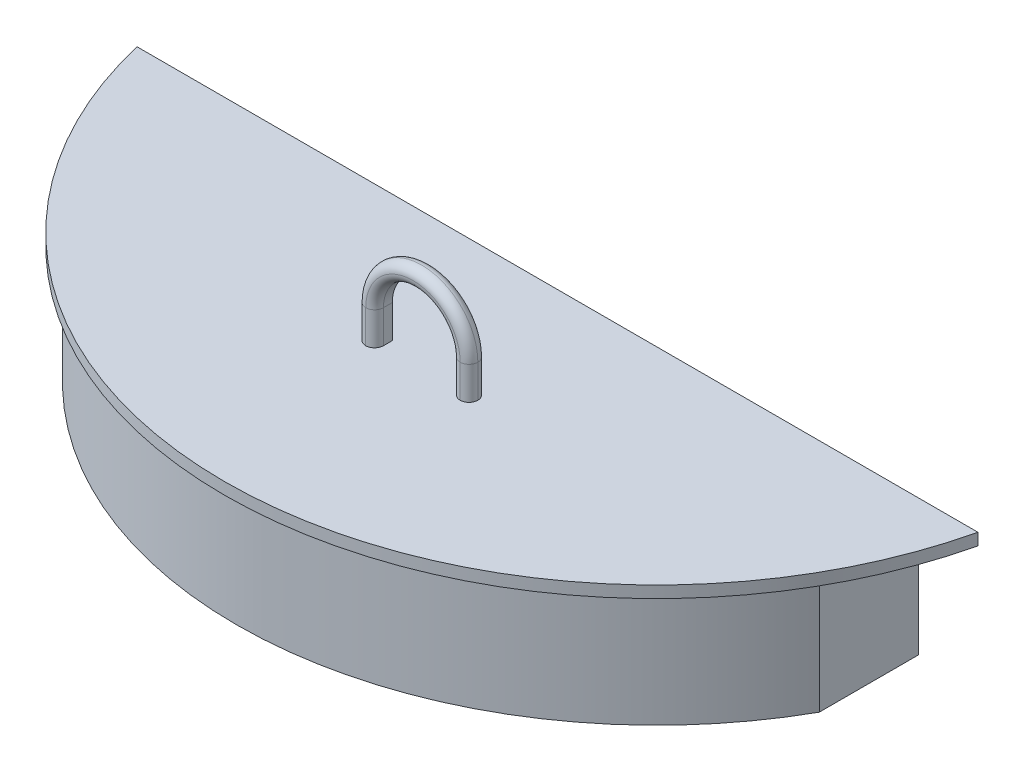
ISO-10303-21;
HEADER;
FILE_DESCRIPTION(('STEP AP214'),'2;1');
FILE_NAME('part.step','',(''),(''),'','','');
FILE_SCHEMA(('AUTOMOTIVE_DESIGN { 1 0 10303 214 1 1 1 1 }'));
ENDSEC;
DATA;
#1=APPLICATION_CONTEXT('core data for automotive mechanical design processes');
#2=APPLICATION_PROTOCOL_DEFINITION('international standard','automotive_design',2000,#1);
#3=PRODUCT_CONTEXT('',#1,'mechanical');
#4=PRODUCT('Part','Part','',(#3));
#5=PRODUCT_RELATED_PRODUCT_CATEGORY('part','',(#4));
#6=PRODUCT_DEFINITION_FORMATION('','',#4);
#7=PRODUCT_DEFINITION_CONTEXT('part definition',#1,'design');
#8=PRODUCT_DEFINITION('design','',#6,#7);
#9=PRODUCT_DEFINITION_SHAPE('','',#8);
#10=(LENGTH_UNIT() NAMED_UNIT(*) SI_UNIT(.MILLI.,.METRE.));
#11=(NAMED_UNIT(*) PLANE_ANGLE_UNIT() SI_UNIT($,.RADIAN.));
#12=(NAMED_UNIT(*) SI_UNIT($,.STERADIAN.) SOLID_ANGLE_UNIT());
#13=UNCERTAINTY_MEASURE_WITH_UNIT(LENGTH_MEASURE(1.E-05),#10,'distance_accuracy_value','');
#14=(GEOMETRIC_REPRESENTATION_CONTEXT(3) GLOBAL_UNCERTAINTY_ASSIGNED_CONTEXT((#13)) GLOBAL_UNIT_ASSIGNED_CONTEXT((#10,
#11,#12)) REPRESENTATION_CONTEXT('',''));
#15=CARTESIAN_POINT('',(0.,0.,0.));
#16=DIRECTION('',(0.,0.,1.));
#17=DIRECTION('',(1.,0.,0.));
#18=AXIS2_PLACEMENT_3D('',#15,#16,#17);
#19=CARTESIAN_POINT('',(0.,20.,0.));
#20=DIRECTION('',(0.,1.,0.));
#21=DIRECTION('',(0.,0.,1.));
#22=AXIS2_PLACEMENT_3D('',#19,#20,#21);
#23=PLANE('',#22);
#24=CARTESIAN_POINT('',(8.,20.,39.8));
#25=DIRECTION('',(0.,1.,0.));
#26=DIRECTION('',(0.,0.,1.));
#27=AXIS2_PLACEMENT_3D('',#24,#25,#26);
#28=CIRCLE('',#27,1.5);
#29=CARTESIAN_POINT('',(9.5,20.,39.8));
#30=VERTEX_POINT('',#29);
#31=CARTESIAN_POINT('',(8.,20.,38.3));
#32=VERTEX_POINT('',#31);
#33=EDGE_CURVE('E496',#30,#32,#28,.T.);
#34=ORIENTED_EDGE('',*,*,#33,.T.);
#35=CARTESIAN_POINT('',(8.,20.,39.8));
#36=DIRECTION('',(0.,1.,0.));
#37=DIRECTION('',(0.,0.,1.));
#38=AXIS2_PLACEMENT_3D('',#35,#36,#37);
#39=CIRCLE('',#38,1.5);
#40=CARTESIAN_POINT('',(6.5,20.,39.8));
#41=VERTEX_POINT('',#40);
#42=EDGE_CURVE('E498',#32,#41,#39,.T.);
#43=ORIENTED_EDGE('',*,*,#42,.T.);
#44=CARTESIAN_POINT('',(8.,20.,39.8));
#45=DIRECTION('',(0.,1.,0.));
#46=DIRECTION('',(0.,0.,1.));
#47=AXIS2_PLACEMENT_3D('',#44,#45,#46);
#48=CIRCLE('',#47,1.5);
#49=CARTESIAN_POINT('',(8.,20.,41.3));
#50=VERTEX_POINT('',#49);
#51=EDGE_CURVE('E494',#41,#50,#48,.T.);
#52=ORIENTED_EDGE('',*,*,#51,.T.);
#53=CARTESIAN_POINT('',(8.,20.,39.8));
#54=DIRECTION('',(0.,1.,0.));
#55=DIRECTION('',(0.,0.,1.));
#56=AXIS2_PLACEMENT_3D('',#53,#54,#55);
#57=CIRCLE('',#56,1.5);
#58=EDGE_CURVE('E489',#50,#30,#57,.T.);
#59=ORIENTED_EDGE('',*,*,#58,.T.);
#60=EDGE_LOOP('',(#34,#43,#52,#59));
#61=FACE_BOUND('',#60,.T.);
#62=CARTESIAN_POINT('',(-8.,20.,39.8));
#63=DIRECTION('',(0.,1.,0.));
#64=DIRECTION('',(0.,0.,1.));
#65=AXIS2_PLACEMENT_3D('',#62,#63,#64);
#66=CIRCLE('',#65,1.5);
#67=CARTESIAN_POINT('',(-6.5,20.,39.8));
#68=VERTEX_POINT('',#67);
#69=CARTESIAN_POINT('',(-8.,20.,38.3));
#70=VERTEX_POINT('',#69);
#71=EDGE_CURVE('E500',#68,#70,#66,.T.);
#72=ORIENTED_EDGE('',*,*,#71,.T.);
#73=CARTESIAN_POINT('',(-8.,20.,39.8));
#74=DIRECTION('',(0.,1.,0.));
#75=DIRECTION('',(0.,0.,1.));
#76=AXIS2_PLACEMENT_3D('',#73,#74,#75);
#77=CIRCLE('',#76,1.5);
#78=CARTESIAN_POINT('',(-9.5,20.,39.8));
#79=VERTEX_POINT('',#78);
#80=EDGE_CURVE('E205',#70,#79,#77,.T.);
#81=ORIENTED_EDGE('',*,*,#80,.T.);
#82=CARTESIAN_POINT('',(-8.,20.,39.8));
#83=DIRECTION('',(0.,1.,0.));
#84=DIRECTION('',(0.,0.,1.));
#85=AXIS2_PLACEMENT_3D('',#82,#83,#84);
#86=CIRCLE('',#85,1.5);
#87=CARTESIAN_POINT('',(-8.,20.,41.3));
#88=VERTEX_POINT('',#87);
#89=EDGE_CURVE('E486',#79,#88,#86,.T.);
#90=ORIENTED_EDGE('',*,*,#89,.T.);
#91=CARTESIAN_POINT('',(-8.,20.,39.8));
#92=DIRECTION('',(0.,1.,0.));
#93=DIRECTION('',(0.,0.,1.));
#94=AXIS2_PLACEMENT_3D('',#91,#92,#93);
#95=CIRCLE('',#94,1.5);
#96=EDGE_CURVE('E492',#88,#68,#95,.T.);
#97=ORIENTED_EDGE('',*,*,#96,.T.);
#98=EDGE_LOOP('',(#72,#81,#90,#97));
#99=FACE_BOUND('',#98,.T.);
#100=DIRECTION('',(0.,0.,-1.));
#101=VECTOR('',#100,1.);
#102=CARTESIAN_POINT('',(60.2,20.,34.1262362413437));
#103=LINE('',#102,#101);
#104=CARTESIAN_POINT('',(60.2,20.,34.1262362413437));
#105=VERTEX_POINT('',#104);
#106=CARTESIAN_POINT('',(60.2,20.,19.8));
#107=VERTEX_POINT('',#106);
#108=EDGE_CURVE('E453',#105,#107,#103,.T.);
#109=ORIENTED_EDGE('',*,*,#108,.F.);
#110=CARTESIAN_POINT('',(0.,20.,0.));
#111=DIRECTION('',(0.,1.,0.));
#112=DIRECTION('',(0.,0.,1.));
#113=AXIS2_PLACEMENT_3D('',#110,#111,#112);
#114=CIRCLE('',#113,69.2);
#115=CARTESIAN_POINT('',(-60.2,20.,34.1262362413437));
#116=VERTEX_POINT('',#115);
#117=EDGE_CURVE('E438',#116,#105,#114,.T.);
#118=ORIENTED_EDGE('',*,*,#117,.F.);
#119=DIRECTION('',(0.,0.,1.));
#120=VECTOR('',#119,1.);
#121=CARTESIAN_POINT('',(-60.2,20.,19.8));
#122=LINE('',#121,#120);
#123=CARTESIAN_POINT('',(-60.2,20.,19.8));
#124=VERTEX_POINT('',#123);
#125=EDGE_CURVE('E433',#124,#116,#122,.T.);
#126=ORIENTED_EDGE('',*,*,#125,.F.);
#127=DIRECTION('',(-1.,0.,0.));
#128=VECTOR('',#127,1.);
#129=CARTESIAN_POINT('',(60.2,20.,19.8));
#130=LINE('',#129,#128);
#131=EDGE_CURVE('E450',#107,#124,#130,.T.);
#132=ORIENTED_EDGE('',*,*,#131,.F.);
#133=EDGE_LOOP('',(#109,#118,#126,#132));
#134=FACE_BOUND('',#133,.T.);
#135=ADVANCED_FACE('F40',(#61,#99,#134),#23,.F.);
#136=CARTESIAN_POINT('',(0.,22.,0.));
#137=DIRECTION('',(0.,1.,0.));
#138=DIRECTION('',(0.,0.,1.));
#139=AXIS2_PLACEMENT_3D('',#136,#137,#138);
#140=PLANE('',#139);
#141=CARTESIAN_POINT('',(0.,22.,0.));
#142=DIRECTION('',(0.,1.,0.));
#143=DIRECTION('',(0.,0.,1.));
#144=AXIS2_PLACEMENT_3D('',#141,#142,#143);
#145=CIRCLE('',#144,73.2);
#146=CARTESIAN_POINT('',(-71.2460525222275,22.,16.8));
#147=VERTEX_POINT('',#146);
#148=CARTESIAN_POINT('',(71.2460525222275,22.,16.8));
#149=VERTEX_POINT('',#148);
#150=EDGE_CURVE('E447',#147,#149,#145,.T.);
#151=ORIENTED_EDGE('',*,*,#150,.T.);
#152=DIRECTION('',(-1.,0.,0.));
#153=VECTOR('',#152,1.);
#154=CARTESIAN_POINT('',(0.,22.,16.8));
#155=LINE('',#154,#153);
#156=EDGE_CURVE('E393',#149,#147,#155,.T.);
#157=ORIENTED_EDGE('',*,*,#156,.T.);
#158=EDGE_LOOP('',(#151,#157));
#159=FACE_BOUND('',#158,.T.);
#160=CARTESIAN_POINT('',(8.,22.,39.8));
#161=DIRECTION('',(0.,1.,0.));
#162=DIRECTION('',(0.,0.,1.));
#163=AXIS2_PLACEMENT_3D('',#160,#161,#162);
#164=CIRCLE('',#163,1.5);
#165=CARTESIAN_POINT('',(9.5,22.,39.8));
#166=VERTEX_POINT('',#165);
#167=CARTESIAN_POINT('',(8.,22.,41.3));
#168=VERTEX_POINT('',#167);
#169=EDGE_CURVE('E59',#166,#168,#164,.F.);
#170=ORIENTED_EDGE('',*,*,#169,.T.);
#171=CARTESIAN_POINT('',(8.,22.,39.8));
#172=DIRECTION('',(0.,1.,0.));
#173=DIRECTION('',(0.,0.,1.));
#174=AXIS2_PLACEMENT_3D('',#171,#172,#173);
#175=CIRCLE('',#174,1.5);
#176=CARTESIAN_POINT('',(6.5,22.,39.8));
#177=VERTEX_POINT('',#176);
#178=EDGE_CURVE('E50',#168,#177,#175,.F.);
#179=ORIENTED_EDGE('',*,*,#178,.T.);
#180=DIRECTION('',(0.,0.,-1.));
#181=VECTOR('',#180,1.);
#182=CARTESIAN_POINT('',(6.5,22.,0.));
#183=LINE('',#182,#181);
#184=CARTESIAN_POINT('',(6.5,22.,38.3));
#185=VERTEX_POINT('',#184);
#186=EDGE_CURVE('E471',#177,#185,#183,.T.);
#187=ORIENTED_EDGE('',*,*,#186,.T.);
#188=DIRECTION('',(1.,0.,0.));
#189=VECTOR('',#188,1.);
#190=CARTESIAN_POINT('',(0.,22.,38.3));
#191=LINE('',#190,#189);
#192=CARTESIAN_POINT('',(8.,22.,38.3));
#193=VERTEX_POINT('',#192);
#194=EDGE_CURVE('E473',#185,#193,#191,.T.);
#195=ORIENTED_EDGE('',*,*,#194,.T.);
#196=CARTESIAN_POINT('',(8.,22.,39.8));
#197=DIRECTION('',(0.,1.,0.));
#198=DIRECTION('',(0.,0.,1.));
#199=AXIS2_PLACEMENT_3D('',#196,#197,#198);
#200=CIRCLE('',#199,1.5);
#201=EDGE_CURVE('E203',#193,#166,#200,.F.);
#202=ORIENTED_EDGE('',*,*,#201,.T.);
#203=EDGE_LOOP('',(#170,#179,#187,#195,#202));
#204=FACE_BOUND('',#203,.T.);
#205=DIRECTION('',(0.,0.,-1.));
#206=VECTOR('',#205,1.);
#207=CARTESIAN_POINT('',(-6.5,22.,0.));
#208=LINE('',#207,#206);
#209=CARTESIAN_POINT('',(-6.5,22.,39.8));
#210=VERTEX_POINT('',#209);
#211=CARTESIAN_POINT('',(-6.5,22.,38.3));
#212=VERTEX_POINT('',#211);
#213=EDGE_CURVE('E371',#210,#212,#208,.T.);
#214=ORIENTED_EDGE('',*,*,#213,.F.);
#215=CARTESIAN_POINT('',(-8.,22.,39.8));
#216=DIRECTION('',(0.,1.,0.));
#217=DIRECTION('',(0.,0.,1.));
#218=AXIS2_PLACEMENT_3D('',#215,#216,#217);
#219=CIRCLE('',#218,1.5);
#220=CARTESIAN_POINT('',(-8.,22.,41.3));
#221=VERTEX_POINT('',#220);
#222=EDGE_CURVE('E11',#210,#221,#219,.F.);
#223=ORIENTED_EDGE('',*,*,#222,.T.);
#224=CARTESIAN_POINT('',(-8.,22.,39.8));
#225=DIRECTION('',(0.,1.,0.));
#226=DIRECTION('',(0.,0.,1.));
#227=AXIS2_PLACEMENT_3D('',#224,#225,#226);
#228=CIRCLE('',#227,1.5);
#229=CARTESIAN_POINT('',(-9.5,22.,39.8));
#230=VERTEX_POINT('',#229);
#231=EDGE_CURVE('E123',#221,#230,#228,.F.);
#232=ORIENTED_EDGE('',*,*,#231,.T.);
#233=CARTESIAN_POINT('',(-8.,22.,39.8));
#234=DIRECTION('',(0.,1.,0.));
#235=DIRECTION('',(0.,0.,1.));
#236=AXIS2_PLACEMENT_3D('',#233,#234,#235);
#237=CIRCLE('',#236,1.5);
#238=CARTESIAN_POINT('',(-8.,22.,38.3));
#239=VERTEX_POINT('',#238);
#240=EDGE_CURVE('E194',#230,#239,#237,.F.);
#241=ORIENTED_EDGE('',*,*,#240,.T.);
#242=EDGE_CURVE('E476',#239,#212,#191,.T.);
#243=ORIENTED_EDGE('',*,*,#242,.T.);
#244=EDGE_LOOP('',(#214,#223,#232,#241,#243));
#245=FACE_BOUND('',#244,.T.);
#246=ADVANCED_FACE('F190',(#159,#204,#245),#140,.T.);
#247=CARTESIAN_POINT('',(0.,0.,16.8));
#248=DIRECTION('',(0.,0.,-1.));
#249=DIRECTION('',(-1.,0.,0.));
#250=AXIS2_PLACEMENT_3D('',#247,#248,#249);
#251=PLANE('',#250);
#252=DIRECTION('',(0.,-1.,0.));
#253=VECTOR('',#252,1.);
#254=CARTESIAN_POINT('',(71.2460525222275,22.,16.8));
#255=LINE('',#254,#253);
#256=CARTESIAN_POINT('',(71.2460525222275,20.,16.8));
#257=VERTEX_POINT('',#256);
#258=EDGE_CURVE('E462',#149,#257,#255,.T.);
#259=ORIENTED_EDGE('',*,*,#258,.T.);
#260=DIRECTION('',(-1.,0.,0.));
#261=VECTOR('',#260,1.);
#262=CARTESIAN_POINT('',(0.,20.,16.8));
#263=LINE('',#262,#261);
#264=CARTESIAN_POINT('',(-71.2460525222275,20.,16.8));
#265=VERTEX_POINT('',#264);
#266=EDGE_CURVE('E459',#257,#265,#263,.T.);
#267=ORIENTED_EDGE('',*,*,#266,.T.);
#268=DIRECTION('',(0.,-1.,0.));
#269=VECTOR('',#268,1.);
#270=CARTESIAN_POINT('',(-71.2460525222275,22.,16.8));
#271=LINE('',#270,#269);
#272=EDGE_CURVE('E385',#265,#147,#271,.F.);
#273=ORIENTED_EDGE('',*,*,#272,.T.);
#274=ORIENTED_EDGE('',*,*,#156,.F.);
#275=EDGE_LOOP('',(#259,#267,#273,#274));
#276=FACE_BOUND('',#275,.T.);
#277=ADVANCED_FACE('F556',(#276),#251,.T.);
#278=CARTESIAN_POINT('',(-60.2,20.,19.8));
#279=DIRECTION('',(1.,0.,0.));
#280=DIRECTION('',(0.,0.,-1.));
#281=AXIS2_PLACEMENT_3D('',#278,#279,#280);
#282=PLANE('',#281);
#283=DIRECTION('',(0.,0.,1.));
#284=VECTOR('',#283,1.);
#285=CARTESIAN_POINT('',(-60.2,0.,19.8));
#286=LINE('',#285,#284);
#287=CARTESIAN_POINT('',(-60.2,0.,19.8));
#288=VERTEX_POINT('',#287);
#289=CARTESIAN_POINT('',(-60.2,0.,34.1262362413437));
#290=VERTEX_POINT('',#289);
#291=EDGE_CURVE('E434',#288,#290,#286,.T.);
#292=ORIENTED_EDGE('',*,*,#291,.F.);
#293=DIRECTION('',(0.,-1.,0.));
#294=VECTOR('',#293,1.);
#295=CARTESIAN_POINT('',(-60.2,20.,19.8));
#296=LINE('',#295,#294);
#297=EDGE_CURVE('E428',#124,#288,#296,.T.);
#298=ORIENTED_EDGE('',*,*,#297,.F.);
#299=ORIENTED_EDGE('',*,*,#125,.T.);
#300=DIRECTION('',(0.,-1.,0.));
#301=VECTOR('',#300,1.);
#302=CARTESIAN_POINT('',(-60.2,20.,34.1262362413437));
#303=LINE('',#302,#301);
#304=EDGE_CURVE('E430',#116,#290,#303,.T.);
#305=ORIENTED_EDGE('',*,*,#304,.T.);
#306=EDGE_LOOP('',(#292,#298,#299,#305));
#307=FACE_BOUND('',#306,.T.);
#308=ADVANCED_FACE('F559',(#307),#282,.T.);
#309=CARTESIAN_POINT('',(60.2,20.,19.8));
#310=DIRECTION('',(0.,0.,1.));
#311=DIRECTION('',(1.,0.,0.));
#312=AXIS2_PLACEMENT_3D('',#309,#310,#311);
#313=PLANE('',#312);
#314=DIRECTION('',(-1.,0.,0.));
#315=VECTOR('',#314,1.);
#316=CARTESIAN_POINT('',(60.2,0.,19.8));
#317=LINE('',#316,#315);
#318=CARTESIAN_POINT('',(60.2,0.,19.8));
#319=VERTEX_POINT('',#318);
#320=EDGE_CURVE('E437',#319,#288,#317,.T.);
#321=ORIENTED_EDGE('',*,*,#320,.F.);
#322=DIRECTION('',(0.,-1.,0.));
#323=VECTOR('',#322,1.);
#324=CARTESIAN_POINT('',(60.2,20.,19.8));
#325=LINE('',#324,#323);
#326=EDGE_CURVE('E426',#107,#319,#325,.T.);
#327=ORIENTED_EDGE('',*,*,#326,.F.);
#328=ORIENTED_EDGE('',*,*,#131,.T.);
#329=ORIENTED_EDGE('',*,*,#297,.T.);
#330=EDGE_LOOP('',(#321,#327,#328,#329));
#331=FACE_BOUND('',#330,.T.);
#332=ADVANCED_FACE('F585',(#331),#313,.T.);
#333=CARTESIAN_POINT('',(60.2,20.,34.1262362413437));
#334=DIRECTION('',(-1.,0.,0.));
#335=DIRECTION('',(0.,0.,1.));
#336=AXIS2_PLACEMENT_3D('',#333,#334,#335);
#337=PLANE('',#336);
#338=DIRECTION('',(0.,0.,-1.));
#339=VECTOR('',#338,1.);
#340=CARTESIAN_POINT('',(60.2,0.,34.1262362413437));
#341=LINE('',#340,#339);
#342=CARTESIAN_POINT('',(60.2,0.,34.1262362413437));
#343=VERTEX_POINT('',#342);
#344=EDGE_CURVE('E441',#343,#319,#341,.T.);
#345=ORIENTED_EDGE('',*,*,#344,.F.);
#346=DIRECTION('',(0.,-1.,0.));
#347=VECTOR('',#346,1.);
#348=CARTESIAN_POINT('',(60.2,20.,34.1262362413437));
#349=LINE('',#348,#347);
#350=EDGE_CURVE('E413',#105,#343,#349,.T.);
#351=ORIENTED_EDGE('',*,*,#350,.F.);
#352=ORIENTED_EDGE('',*,*,#108,.T.);
#353=ORIENTED_EDGE('',*,*,#326,.T.);
#354=EDGE_LOOP('',(#345,#351,#352,#353));
#355=FACE_BOUND('',#354,.T.);
#356=ADVANCED_FACE('F617',(#355),#337,.T.);
#357=CARTESIAN_POINT('',(0.,20.,0.));
#358=DIRECTION('',(0.,-1.,0.));
#359=DIRECTION('',(0.,0.,-1.));
#360=AXIS2_PLACEMENT_3D('',#357,#358,#359);
#361=CYLINDRICAL_SURFACE('',#360,69.2);
#362=CARTESIAN_POINT('',(0.,0.,0.));
#363=DIRECTION('',(0.,1.,0.));
#364=DIRECTION('',(0.,0.,1.));
#365=AXIS2_PLACEMENT_3D('',#362,#363,#364);
#366=CIRCLE('',#365,69.2);
#367=EDGE_CURVE('E444',#290,#343,#366,.T.);
#368=ORIENTED_EDGE('',*,*,#367,.F.);
#369=ORIENTED_EDGE('',*,*,#304,.F.);
#370=ORIENTED_EDGE('',*,*,#117,.T.);
#371=ORIENTED_EDGE('',*,*,#350,.T.);
#372=EDGE_LOOP('',(#368,#369,#370,#371));
#373=FACE_BOUND('',#372,.T.);
#374=ADVANCED_FACE('F613',(#373),#361,.F.);
#375=CARTESIAN_POINT('',(0.,0.,0.));
#376=DIRECTION('',(0.,1.,0.));
#377=DIRECTION('',(0.,0.,1.));
#378=AXIS2_PLACEMENT_3D('',#375,#376,#377);
#379=PLANE('',#378);
#380=DIRECTION('',(0.,0.,-1.));
#381=VECTOR('',#380,1.);
#382=CARTESIAN_POINT('',(62.2,0.,34.6496753231542));
#383=LINE('',#382,#381);
#384=CARTESIAN_POINT('',(62.2,0.,34.6496753231542));
#385=VERTEX_POINT('',#384);
#386=CARTESIAN_POINT('',(62.2,0.,17.8));
#387=VERTEX_POINT('',#386);
#388=EDGE_CURVE('E410',#385,#387,#383,.T.);
#389=ORIENTED_EDGE('',*,*,#388,.F.);
#390=CARTESIAN_POINT('',(0.,0.,0.));
#391=DIRECTION('',(0.,1.,0.));
#392=DIRECTION('',(0.,0.,1.));
#393=AXIS2_PLACEMENT_3D('',#390,#391,#392);
#394=CIRCLE('',#393,71.2);
#395=CARTESIAN_POINT('',(-62.2,0.,34.6496753231542));
#396=VERTEX_POINT('',#395);
#397=EDGE_CURVE('E403',#396,#385,#394,.T.);
#398=ORIENTED_EDGE('',*,*,#397,.F.);
#399=DIRECTION('',(0.,0.,1.));
#400=VECTOR('',#399,1.);
#401=CARTESIAN_POINT('',(-62.2,0.,17.8));
#402=LINE('',#401,#400);
#403=CARTESIAN_POINT('',(-62.2,0.,17.8));
#404=VERTEX_POINT('',#403);
#405=EDGE_CURVE('E405',#404,#396,#402,.T.);
#406=ORIENTED_EDGE('',*,*,#405,.F.);
#407=DIRECTION('',(-1.,0.,0.));
#408=VECTOR('',#407,1.);
#409=CARTESIAN_POINT('',(62.2,0.,17.8));
#410=LINE('',#409,#408);
#411=EDGE_CURVE('E408',#387,#404,#410,.T.);
#412=ORIENTED_EDGE('',*,*,#411,.F.);
#413=EDGE_LOOP('',(#389,#398,#406,#412));
#414=FACE_BOUND('',#413,.T.);
#415=ORIENTED_EDGE('',*,*,#367,.T.);
#416=ORIENTED_EDGE('',*,*,#344,.T.);
#417=ORIENTED_EDGE('',*,*,#320,.T.);
#418=ORIENTED_EDGE('',*,*,#291,.T.);
#419=EDGE_LOOP('',(#415,#416,#417,#418));
#420=FACE_BOUND('',#419,.T.);
#421=ADVANCED_FACE('F608',(#414,#420),#379,.F.);
#422=CARTESIAN_POINT('',(-62.2,20.,17.8));
#423=DIRECTION('',(1.,0.,0.));
#424=DIRECTION('',(0.,0.,-1.));
#425=AXIS2_PLACEMENT_3D('',#422,#423,#424);
#426=PLANE('',#425);
#427=ORIENTED_EDGE('',*,*,#405,.T.);
#428=DIRECTION('',(0.,-1.,0.));
#429=VECTOR('',#428,1.);
#430=CARTESIAN_POINT('',(-62.2,20.,34.6496753231542));
#431=LINE('',#430,#429);
#432=CARTESIAN_POINT('',(-62.2,20.,34.6496753231542));
#433=VERTEX_POINT('',#432);
#434=EDGE_CURVE('E396',#433,#396,#431,.T.);
#435=ORIENTED_EDGE('',*,*,#434,.F.);
#436=DIRECTION('',(0.,0.,1.));
#437=VECTOR('',#436,1.);
#438=CARTESIAN_POINT('',(-62.2,20.,17.8));
#439=LINE('',#438,#437);
#440=CARTESIAN_POINT('',(-62.2,20.,17.8));
#441=VERTEX_POINT('',#440);
#442=EDGE_CURVE('E416',#441,#433,#439,.T.);
#443=ORIENTED_EDGE('',*,*,#442,.F.);
#444=DIRECTION('',(0.,-1.,0.));
#445=VECTOR('',#444,1.);
#446=CARTESIAN_POINT('',(-62.2,20.,17.8));
#447=LINE('',#446,#445);
#448=EDGE_CURVE('E392',#441,#404,#447,.T.);
#449=ORIENTED_EDGE('',*,*,#448,.T.);
#450=EDGE_LOOP('',(#427,#435,#443,#449));
#451=FACE_BOUND('',#450,.T.);
#452=ADVANCED_FACE('F605',(#451),#426,.F.);
#453=CARTESIAN_POINT('',(62.2,20.,17.8));
#454=DIRECTION('',(0.,0.,1.));
#455=DIRECTION('',(1.,0.,0.));
#456=AXIS2_PLACEMENT_3D('',#453,#454,#455);
#457=PLANE('',#456);
#458=ORIENTED_EDGE('',*,*,#411,.T.);
#459=ORIENTED_EDGE('',*,*,#448,.F.);
#460=DIRECTION('',(-1.,0.,0.));
#461=VECTOR('',#460,1.);
#462=CARTESIAN_POINT('',(62.2,20.,17.8));
#463=LINE('',#462,#461);
#464=CARTESIAN_POINT('',(62.2,20.,17.8));
#465=VERTEX_POINT('',#464);
#466=EDGE_CURVE('E419',#465,#441,#463,.T.);
#467=ORIENTED_EDGE('',*,*,#466,.F.);
#468=DIRECTION('',(0.,-1.,0.));
#469=VECTOR('',#468,1.);
#470=CARTESIAN_POINT('',(62.2,20.,17.8));
#471=LINE('',#470,#469);
#472=EDGE_CURVE('E389',#465,#387,#471,.T.);
#473=ORIENTED_EDGE('',*,*,#472,.T.);
#474=EDGE_LOOP('',(#458,#459,#467,#473));
#475=FACE_BOUND('',#474,.T.);
#476=ADVANCED_FACE('F601',(#475),#457,.F.);
#477=CARTESIAN_POINT('',(62.2,20.,34.6496753231542));
#478=DIRECTION('',(-1.,0.,0.));
#479=DIRECTION('',(0.,0.,1.));
#480=AXIS2_PLACEMENT_3D('',#477,#478,#479);
#481=PLANE('',#480);
#482=ORIENTED_EDGE('',*,*,#388,.T.);
#483=ORIENTED_EDGE('',*,*,#472,.F.);
#484=DIRECTION('',(0.,0.,-1.));
#485=VECTOR('',#484,1.);
#486=CARTESIAN_POINT('',(62.2,20.,34.6496753231542));
#487=LINE('',#486,#485);
#488=CARTESIAN_POINT('',(62.2,20.,34.6496753231542));
#489=VERTEX_POINT('',#488);
#490=EDGE_CURVE('E406',#489,#465,#487,.T.);
#491=ORIENTED_EDGE('',*,*,#490,.F.);
#492=DIRECTION('',(0.,-1.,0.));
#493=VECTOR('',#492,1.);
#494=CARTESIAN_POINT('',(62.2,20.,34.6496753231542));
#495=LINE('',#494,#493);
#496=EDGE_CURVE('E399',#489,#385,#495,.T.);
#497=ORIENTED_EDGE('',*,*,#496,.T.);
#498=EDGE_LOOP('',(#482,#483,#491,#497));
#499=FACE_BOUND('',#498,.T.);
#500=ADVANCED_FACE('F571',(#499),#481,.F.);
#501=CARTESIAN_POINT('',(0.,20.,0.));
#502=DIRECTION('',(0.,-1.,0.));
#503=DIRECTION('',(0.,0.,-1.));
#504=AXIS2_PLACEMENT_3D('',#501,#502,#503);
#505=CYLINDRICAL_SURFACE('',#504,71.2);
#506=ORIENTED_EDGE('',*,*,#397,.T.);
#507=ORIENTED_EDGE('',*,*,#496,.F.);
#508=CARTESIAN_POINT('',(0.,20.,0.));
#509=DIRECTION('',(0.,1.,0.));
#510=DIRECTION('',(0.,0.,1.));
#511=AXIS2_PLACEMENT_3D('',#508,#509,#510);
#512=CIRCLE('',#511,71.2);
#513=EDGE_CURVE('E402',#433,#489,#512,.T.);
#514=ORIENTED_EDGE('',*,*,#513,.F.);
#515=ORIENTED_EDGE('',*,*,#434,.T.);
#516=EDGE_LOOP('',(#506,#507,#514,#515));
#517=FACE_BOUND('',#516,.T.);
#518=ADVANCED_FACE('F564',(#517),#505,.T.);
#519=ORIENTED_EDGE('',*,*,#513,.T.);
#520=ORIENTED_EDGE('',*,*,#490,.T.);
#521=ORIENTED_EDGE('',*,*,#466,.T.);
#522=ORIENTED_EDGE('',*,*,#442,.T.);
#523=EDGE_LOOP('',(#519,#520,#521,#522));
#524=FACE_BOUND('',#523,.T.);
#525=ORIENTED_EDGE('',*,*,#266,.F.);
#526=CARTESIAN_POINT('',(0.,20.,0.));
#527=DIRECTION('',(0.,1.,0.));
#528=DIRECTION('',(0.,0.,1.));
#529=AXIS2_PLACEMENT_3D('',#526,#527,#528);
#530=CIRCLE('',#529,73.2);
#531=EDGE_CURVE('E469',#265,#257,#530,.T.);
#532=ORIENTED_EDGE('',*,*,#531,.F.);
#533=EDGE_LOOP('',(#525,#532));
#534=FACE_BOUND('',#533,.T.);
#535=ADVANCED_FACE('F552',(#524,#534),#23,.F.);
#536=CARTESIAN_POINT('',(0.,22.,0.));
#537=DIRECTION('',(0.,-1.,0.));
#538=DIRECTION('',(0.,0.,-1.));
#539=AXIS2_PLACEMENT_3D('',#536,#537,#538);
#540=CYLINDRICAL_SURFACE('',#539,73.2);
#541=ORIENTED_EDGE('',*,*,#258,.F.);
#542=ORIENTED_EDGE('',*,*,#150,.F.);
#543=ORIENTED_EDGE('',*,*,#272,.F.);
#544=ORIENTED_EDGE('',*,*,#531,.T.);
#545=EDGE_LOOP('',(#541,#542,#543,#544));
#546=FACE_BOUND('',#545,.T.);
#547=ADVANCED_FACE('F563',(#546),#540,.T.);
#548=CARTESIAN_POINT('',(0.,27.5812621711872,38.3));
#549=DIRECTION('',(0.,0.,1.));
#550=DIRECTION('',(1.,0.,0.));
#551=AXIS2_PLACEMENT_3D('',#548,#549,#550);
#552=CYLINDRICAL_SURFACE('',#551,6.5);
#553=DIRECTION('',(0.,0.,1.));
#554=VECTOR('',#553,1.);
#555=CARTESIAN_POINT('',(6.5,27.5812621711872,38.3));
#556=LINE('',#555,#554);
#557=CARTESIAN_POINT('',(6.5,27.5812621711872,38.3));
#558=VERTEX_POINT('',#557);
#559=CARTESIAN_POINT('',(6.5,27.5812621711872,39.8));
#560=VERTEX_POINT('',#559);
#561=EDGE_CURVE('E383',#558,#560,#556,.T.);
#562=ORIENTED_EDGE('',*,*,#561,.T.);
#563=CARTESIAN_POINT('',(0.,27.5812621711872,39.8));
#564=DIRECTION('',(0.,0.,1.));
#565=DIRECTION('',(1.,0.,0.));
#566=AXIS2_PLACEMENT_3D('',#563,#564,#565);
#567=CIRCLE('',#566,6.5);
#568=CARTESIAN_POINT('',(-6.5,27.5812621711872,39.8));
#569=VERTEX_POINT('',#568);
#570=EDGE_CURVE('E382',#560,#569,#567,.T.);
#571=ORIENTED_EDGE('',*,*,#570,.T.);
#572=DIRECTION('',(0.,0.,1.));
#573=VECTOR('',#572,1.);
#574=CARTESIAN_POINT('',(-6.5,27.5812621711872,38.3));
#575=LINE('',#574,#573);
#576=CARTESIAN_POINT('',(-6.5,27.5812621711872,38.3));
#577=VERTEX_POINT('',#576);
#578=EDGE_CURVE('E370',#577,#569,#575,.T.);
#579=ORIENTED_EDGE('',*,*,#578,.F.);
#580=CARTESIAN_POINT('',(0.,27.5812621711872,38.3));
#581=DIRECTION('',(0.,0.,1.));
#582=DIRECTION('',(1.,0.,0.));
#583=AXIS2_PLACEMENT_3D('',#580,#581,#582);
#584=CIRCLE('',#583,6.5);
#585=EDGE_CURVE('E372',#558,#577,#584,.T.);
#586=ORIENTED_EDGE('',*,*,#585,.F.);
#587=EDGE_LOOP('',(#562,#571,#579,#586));
#588=FACE_BOUND('',#587,.T.);
#589=ADVANCED_FACE('F381',(#588),#552,.F.);
#590=CARTESIAN_POINT('',(0.,0.,38.3));
#591=DIRECTION('',(0.,0.,1.));
#592=DIRECTION('',(1.,0.,0.));
#593=AXIS2_PLACEMENT_3D('',#590,#591,#592);
#594=PLANE('',#593);
#595=CARTESIAN_POINT('',(0.,27.5812621711872,38.3));
#596=DIRECTION('',(0.,0.,1.));
#597=DIRECTION('',(1.,0.,0.));
#598=AXIS2_PLACEMENT_3D('',#595,#596,#597);
#599=CIRCLE('',#598,8.);
#600=CARTESIAN_POINT('',(-8.,27.5812621711872,38.3));
#601=VERTEX_POINT('',#600);
#602=CARTESIAN_POINT('',(8.,27.5812621711872,38.3));
#603=VERTEX_POINT('',#602);
#604=EDGE_CURVE('E286',#601,#603,#599,.F.);
#605=ORIENTED_EDGE('',*,*,#604,.T.);
#606=DIRECTION('',(0.,1.,0.));
#607=VECTOR('',#606,1.);
#608=CARTESIAN_POINT('',(8.,22.,38.3));
#609=LINE('',#608,#607);
#610=EDGE_CURVE('E480',#603,#193,#609,.F.);
#611=ORIENTED_EDGE('',*,*,#610,.T.);
#612=ORIENTED_EDGE('',*,*,#194,.F.);
#613=DIRECTION('',(0.,1.,0.));
#614=VECTOR('',#613,1.);
#615=CARTESIAN_POINT('',(6.5,0.,38.3));
#616=LINE('',#615,#614);
#617=EDGE_CURVE('E378',#185,#558,#616,.T.);
#618=ORIENTED_EDGE('',*,*,#617,.T.);
#619=ORIENTED_EDGE('',*,*,#585,.T.);
#620=DIRECTION('',(0.,1.,0.));
#621=VECTOR('',#620,1.);
#622=CARTESIAN_POINT('',(-6.5,0.,38.3));
#623=LINE('',#622,#621);
#624=EDGE_CURVE('E266',#212,#577,#623,.T.);
#625=ORIENTED_EDGE('',*,*,#624,.F.);
#626=ORIENTED_EDGE('',*,*,#242,.F.);
#627=DIRECTION('',(0.,1.,0.));
#628=VECTOR('',#627,1.);
#629=CARTESIAN_POINT('',(-8.,0.,38.3));
#630=LINE('',#629,#628);
#631=EDGE_CURVE('E202',#239,#601,#630,.T.);
#632=ORIENTED_EDGE('',*,*,#631,.T.);
#633=EDGE_LOOP('',(#605,#611,#612,#618,#619,#625,#626,#632));
#634=FACE_BOUND('',#633,.T.);
#635=ADVANCED_FACE('F375',(#634),#594,.F.);
#636=CARTESIAN_POINT('',(-6.5,0.,38.3));
#637=DIRECTION('',(1.,0.,0.));
#638=DIRECTION('',(0.,0.,-1.));
#639=AXIS2_PLACEMENT_3D('',#636,#637,#638);
#640=PLANE('',#639);
#641=ORIENTED_EDGE('',*,*,#578,.T.);
#642=DIRECTION('',(0.,1.,0.));
#643=VECTOR('',#642,1.);
#644=CARTESIAN_POINT('',(-6.5,0.,39.8));
#645=LINE('',#644,#643);
#646=EDGE_CURVE('E114',#569,#210,#645,.F.);
#647=ORIENTED_EDGE('',*,*,#646,.T.);
#648=ORIENTED_EDGE('',*,*,#213,.T.);
#649=ORIENTED_EDGE('',*,*,#624,.T.);
#650=EDGE_LOOP('',(#641,#647,#648,#649));
#651=FACE_BOUND('',#650,.T.);
#652=ADVANCED_FACE('F368',(#651),#640,.T.);
#653=CARTESIAN_POINT('',(6.5,0.,38.3));
#654=DIRECTION('',(1.,0.,0.));
#655=DIRECTION('',(0.,0.,-1.));
#656=AXIS2_PLACEMENT_3D('',#653,#654,#655);
#657=PLANE('',#656);
#658=ORIENTED_EDGE('',*,*,#186,.F.);
#659=DIRECTION('',(0.,1.,0.));
#660=VECTOR('',#659,1.);
#661=CARTESIAN_POINT('',(6.5,27.5812621711872,39.8));
#662=LINE('',#661,#660);
#663=EDGE_CURVE('E146',#177,#560,#662,.T.);
#664=ORIENTED_EDGE('',*,*,#663,.T.);
#665=ORIENTED_EDGE('',*,*,#561,.F.);
#666=ORIENTED_EDGE('',*,*,#617,.F.);
#667=EDGE_LOOP('',(#658,#664,#665,#666));
#668=FACE_BOUND('',#667,.T.);
#669=ADVANCED_FACE('F596',(#668),#657,.F.);
#670=CARTESIAN_POINT('',(8.,0.,39.8));
#671=DIRECTION('',(0.,1.,0.));
#672=DIRECTION('',(0.,0.,1.));
#673=AXIS2_PLACEMENT_3D('',#670,#671,#672);
#674=CYLINDRICAL_SURFACE('',#673,1.5);
#675=DIRECTION('',(0.,1.,0.));
#676=VECTOR('',#675,1.);
#677=CARTESIAN_POINT('',(6.5,0.,39.8));
#678=LINE('',#677,#676);
#679=CARTESIAN_POINT('',(6.5,15.4352112884499,39.8));
#680=VERTEX_POINT('',#679);
#681=EDGE_CURVE('E264',#41,#680,#678,.F.);
#682=ORIENTED_EDGE('',*,*,#681,.F.);
#683=ORIENTED_EDGE('',*,*,#42,.F.);
#684=DIRECTION('',(0.,1.,0.));
#685=VECTOR('',#684,1.);
#686=CARTESIAN_POINT('',(8.,0.,38.3));
#687=LINE('',#686,#685);
#688=CARTESIAN_POINT('',(8.,15.4352112884499,38.3));
#689=VERTEX_POINT('',#688);
#690=EDGE_CURVE('E261',#689,#32,#687,.T.);
#691=ORIENTED_EDGE('',*,*,#690,.F.);
#692=CARTESIAN_POINT('',(8.,15.4352112884499,39.8));
#693=DIRECTION('',(0.,-1.,0.));
#694=DIRECTION('',(0.,0.,-1.));
#695=AXIS2_PLACEMENT_3D('',#692,#693,#694);
#696=CIRCLE('',#695,1.5);
#697=EDGE_CURVE('E258',#680,#689,#696,.T.);
#698=ORIENTED_EDGE('',*,*,#697,.F.);
#699=EDGE_LOOP('',(#682,#683,#691,#698));
#700=FACE_BOUND('',#699,.T.);
#701=ADVANCED_FACE('F548',(#700),#674,.T.);
#702=CARTESIAN_POINT('',(8.,0.,39.8));
#703=DIRECTION('',(0.,-1.,0.));
#704=DIRECTION('',(0.,0.,-1.));
#705=AXIS2_PLACEMENT_3D('',#702,#703,#704);
#706=CYLINDRICAL_SURFACE('',#705,1.5);
#707=ORIENTED_EDGE('',*,*,#51,.F.);
#708=ORIENTED_EDGE('',*,*,#681,.T.);
#709=CARTESIAN_POINT('',(8.,15.4352112884499,39.8));
#710=DIRECTION('',(0.,-1.,0.));
#711=DIRECTION('',(0.,0.,-1.));
#712=AXIS2_PLACEMENT_3D('',#709,#710,#711);
#713=CIRCLE('',#712,1.5);
#714=CARTESIAN_POINT('',(8.,15.4352112884499,41.3));
#715=VERTEX_POINT('',#714);
#716=EDGE_CURVE('E253',#715,#680,#713,.T.);
#717=ORIENTED_EDGE('',*,*,#716,.F.);
#718=DIRECTION('',(0.,1.,0.));
#719=VECTOR('',#718,1.);
#720=CARTESIAN_POINT('',(8.,15.4352112884499,41.3));
#721=LINE('',#720,#719);
#722=EDGE_CURVE('E250',#50,#715,#721,.F.);
#723=ORIENTED_EDGE('',*,*,#722,.F.);
#724=EDGE_LOOP('',(#707,#708,#717,#723));
#725=FACE_BOUND('',#724,.T.);
#726=ADVANCED_FACE('F546',(#725),#706,.T.);
#727=CARTESIAN_POINT('',(8.,0.,39.8));
#728=DIRECTION('',(0.,-1.,0.));
#729=DIRECTION('',(0.,0.,-1.));
#730=AXIS2_PLACEMENT_3D('',#727,#728,#729);
#731=CYLINDRICAL_SURFACE('',#730,1.5);
#732=ORIENTED_EDGE('',*,*,#690,.T.);
#733=ORIENTED_EDGE('',*,*,#33,.F.);
#734=DIRECTION('',(0.,1.,0.));
#735=VECTOR('',#734,1.);
#736=CARTESIAN_POINT('',(9.5,20.,39.8));
#737=LINE('',#736,#735);
#738=CARTESIAN_POINT('',(9.5,15.4352112884499,39.8));
#739=VERTEX_POINT('',#738);
#740=EDGE_CURVE('E248',#739,#30,#737,.T.);
#741=ORIENTED_EDGE('',*,*,#740,.F.);
#742=CARTESIAN_POINT('',(8.,15.4352112884499,39.8));
#743=DIRECTION('',(0.,-1.,0.));
#744=DIRECTION('',(0.,0.,-1.));
#745=AXIS2_PLACEMENT_3D('',#742,#743,#744);
#746=CIRCLE('',#745,1.5);
#747=EDGE_CURVE('E245',#689,#739,#746,.T.);
#748=ORIENTED_EDGE('',*,*,#747,.F.);
#749=EDGE_LOOP('',(#732,#733,#741,#748));
#750=FACE_BOUND('',#749,.T.);
#751=ADVANCED_FACE('F538',(#750),#731,.T.);
#752=CARTESIAN_POINT('',(0.,15.4352112884499,39.8));
#753=DIRECTION('',(0.,0.,1.));
#754=DIRECTION('',(1.,0.,0.));
#755=AXIS2_PLACEMENT_3D('',#752,#753,#754);
#756=TOROIDAL_SURFACE('',#755,8.,1.5);
#757=CARTESIAN_POINT('',(0.,15.4352112884499,39.8));
#758=DIRECTION('',(0.,0.,1.));
#759=DIRECTION('',(1.,0.,0.));
#760=AXIS2_PLACEMENT_3D('',#757,#758,#759);
#761=CIRCLE('',#760,6.5);
#762=CARTESIAN_POINT('',(-6.5,15.4352112884499,39.8));
#763=VERTEX_POINT('',#762);
#764=EDGE_CURVE('E256',#680,#763,#761,.F.);
#765=ORIENTED_EDGE('',*,*,#764,.F.);
#766=ORIENTED_EDGE('',*,*,#697,.T.);
#767=CARTESIAN_POINT('',(0.,15.4352112884499,38.3));
#768=DIRECTION('',(0.,0.,1.));
#769=DIRECTION('',(1.,0.,0.));
#770=AXIS2_PLACEMENT_3D('',#767,#768,#769);
#771=CIRCLE('',#770,8.);
#772=CARTESIAN_POINT('',(-8.,15.4352112884499,38.3));
#773=VERTEX_POINT('',#772);
#774=EDGE_CURVE('E242',#773,#689,#771,.T.);
#775=ORIENTED_EDGE('',*,*,#774,.F.);
#776=CARTESIAN_POINT('',(-8.,15.4352112884499,39.8));
#777=DIRECTION('',(0.,1.,0.));
#778=DIRECTION('',(0.,0.,1.));
#779=AXIS2_PLACEMENT_3D('',#776,#777,#778);
#780=CIRCLE('',#779,1.5);
#781=EDGE_CURVE('E239',#763,#773,#780,.T.);
#782=ORIENTED_EDGE('',*,*,#781,.F.);
#783=EDGE_LOOP('',(#765,#766,#775,#782));
#784=FACE_BOUND('',#783,.T.);
#785=ADVANCED_FACE('F533',(#784),#756,.T.);
#786=CARTESIAN_POINT('',(0.,15.4352112884499,39.8));
#787=DIRECTION('',(0.,0.,1.));
#788=DIRECTION('',(1.,0.,0.));
#789=AXIS2_PLACEMENT_3D('',#786,#787,#788);
#790=TOROIDAL_SURFACE('',#789,8.,1.5);
#791=ORIENTED_EDGE('',*,*,#716,.T.);
#792=ORIENTED_EDGE('',*,*,#764,.T.);
#793=CARTESIAN_POINT('',(-8.,15.4352112884499,39.8));
#794=DIRECTION('',(0.,1.,0.));
#795=DIRECTION('',(0.,0.,1.));
#796=AXIS2_PLACEMENT_3D('',#793,#794,#795);
#797=CIRCLE('',#796,1.5);
#798=CARTESIAN_POINT('',(-8.,15.4352112884499,41.3));
#799=VERTEX_POINT('',#798);
#800=EDGE_CURVE('E233',#799,#763,#797,.T.);
#801=ORIENTED_EDGE('',*,*,#800,.F.);
#802=CARTESIAN_POINT('',(0.,15.4352112884499,41.3));
#803=DIRECTION('',(0.,0.,1.));
#804=DIRECTION('',(1.,0.,0.));
#805=AXIS2_PLACEMENT_3D('',#802,#803,#804);
#806=CIRCLE('',#805,8.);
#807=EDGE_CURVE('E230',#715,#799,#806,.F.);
#808=ORIENTED_EDGE('',*,*,#807,.F.);
#809=EDGE_LOOP('',(#791,#792,#801,#808));
#810=FACE_BOUND('',#809,.T.);
#811=ADVANCED_FACE('F532',(#810),#790,.T.);
#812=CARTESIAN_POINT('',(8.,0.,39.8));
#813=DIRECTION('',(0.,1.,0.));
#814=DIRECTION('',(0.,0.,1.));
#815=AXIS2_PLACEMENT_3D('',#812,#813,#814);
#816=CYLINDRICAL_SURFACE('',#815,1.5);
#817=ORIENTED_EDGE('',*,*,#58,.F.);
#818=ORIENTED_EDGE('',*,*,#722,.T.);
#819=CARTESIAN_POINT('',(8.,15.4352112884499,39.8));
#820=DIRECTION('',(0.,-1.,0.));
#821=DIRECTION('',(0.,0.,-1.));
#822=AXIS2_PLACEMENT_3D('',#819,#820,#821);
#823=CIRCLE('',#822,1.5);
#824=EDGE_CURVE('E227',#739,#715,#823,.T.);
#825=ORIENTED_EDGE('',*,*,#824,.F.);
#826=ORIENTED_EDGE('',*,*,#740,.T.);
#827=EDGE_LOOP('',(#817,#818,#825,#826));
#828=FACE_BOUND('',#827,.T.);
#829=ADVANCED_FACE('F542',(#828),#816,.T.);
#830=CARTESIAN_POINT('',(0.,15.4352112884499,39.8));
#831=DIRECTION('',(0.,0.,1.));
#832=DIRECTION('',(1.,0.,0.));
#833=AXIS2_PLACEMENT_3D('',#830,#831,#832);
#834=TOROIDAL_SURFACE('',#833,8.,1.5);
#835=ORIENTED_EDGE('',*,*,#774,.T.);
#836=ORIENTED_EDGE('',*,*,#747,.T.);
#837=CARTESIAN_POINT('',(0.,15.4352112884499,39.8));
#838=DIRECTION('',(0.,0.,1.));
#839=DIRECTION('',(1.,0.,0.));
#840=AXIS2_PLACEMENT_3D('',#837,#838,#839);
#841=CIRCLE('',#840,9.5);
#842=CARTESIAN_POINT('',(-9.5,15.4352112884499,39.8));
#843=VERTEX_POINT('',#842);
#844=EDGE_CURVE('E224',#843,#739,#841,.T.);
#845=ORIENTED_EDGE('',*,*,#844,.F.);
#846=CARTESIAN_POINT('',(-8.,15.4352112884499,39.8));
#847=DIRECTION('',(0.,1.,0.));
#848=DIRECTION('',(0.,0.,1.));
#849=AXIS2_PLACEMENT_3D('',#846,#847,#848);
#850=CIRCLE('',#849,1.5);
#851=EDGE_CURVE('E221',#773,#843,#850,.T.);
#852=ORIENTED_EDGE('',*,*,#851,.F.);
#853=EDGE_LOOP('',(#835,#836,#845,#852));
#854=FACE_BOUND('',#853,.T.);
#855=ADVANCED_FACE('F525',(#854),#834,.T.);
#856=CARTESIAN_POINT('',(-8.,0.,39.8));
#857=DIRECTION('',(0.,-1.,0.));
#858=DIRECTION('',(0.,0.,-1.));
#859=AXIS2_PLACEMENT_3D('',#856,#857,#858);
#860=CYLINDRICAL_SURFACE('',#859,1.5);
#861=DIRECTION('',(0.,1.,0.));
#862=VECTOR('',#861,1.);
#863=CARTESIAN_POINT('',(-8.,15.4352112884499,38.3));
#864=LINE('',#863,#862);
#865=EDGE_CURVE('E218',#70,#773,#864,.F.);
#866=ORIENTED_EDGE('',*,*,#865,.F.);
#867=ORIENTED_EDGE('',*,*,#71,.F.);
#868=DIRECTION('',(0.,1.,0.));
#869=VECTOR('',#868,1.);
#870=CARTESIAN_POINT('',(-6.5,20.,39.8));
#871=LINE('',#870,#869);
#872=EDGE_CURVE('E236',#763,#68,#871,.T.);
#873=ORIENTED_EDGE('',*,*,#872,.F.);
#874=ORIENTED_EDGE('',*,*,#781,.T.);
#875=EDGE_LOOP('',(#866,#867,#873,#874));
#876=FACE_BOUND('',#875,.T.);
#877=ADVANCED_FACE('F520',(#876),#860,.T.);
#878=CARTESIAN_POINT('',(-8.,0.,39.8));
#879=DIRECTION('',(0.,1.,0.));
#880=DIRECTION('',(0.,0.,1.));
#881=AXIS2_PLACEMENT_3D('',#878,#879,#880);
#882=CYLINDRICAL_SURFACE('',#881,1.5);
#883=ORIENTED_EDGE('',*,*,#872,.T.);
#884=ORIENTED_EDGE('',*,*,#96,.F.);
#885=DIRECTION('',(0.,1.,0.));
#886=VECTOR('',#885,1.);
#887=CARTESIAN_POINT('',(-8.,0.,41.3));
#888=LINE('',#887,#886);
#889=EDGE_CURVE('E216',#799,#88,#888,.T.);
#890=ORIENTED_EDGE('',*,*,#889,.F.);
#891=ORIENTED_EDGE('',*,*,#800,.T.);
#892=EDGE_LOOP('',(#883,#884,#890,#891));
#893=FACE_BOUND('',#892,.T.);
#894=ADVANCED_FACE('F517',(#893),#882,.T.);
#895=CARTESIAN_POINT('',(0.,15.4352112884499,39.8));
#896=DIRECTION('',(0.,0.,1.));
#897=DIRECTION('',(1.,0.,0.));
#898=AXIS2_PLACEMENT_3D('',#895,#896,#897);
#899=TOROIDAL_SURFACE('',#898,8.,1.5);
#900=ORIENTED_EDGE('',*,*,#824,.T.);
#901=ORIENTED_EDGE('',*,*,#807,.T.);
#902=CARTESIAN_POINT('',(-8.,15.4352112884499,39.8));
#903=DIRECTION('',(0.,1.,0.));
#904=DIRECTION('',(0.,0.,1.));
#905=AXIS2_PLACEMENT_3D('',#902,#903,#904);
#906=CIRCLE('',#905,1.5);
#907=EDGE_CURVE('E213',#843,#799,#906,.T.);
#908=ORIENTED_EDGE('',*,*,#907,.F.);
#909=ORIENTED_EDGE('',*,*,#844,.T.);
#910=EDGE_LOOP('',(#900,#901,#908,#909));
#911=FACE_BOUND('',#910,.T.);
#912=ADVANCED_FACE('F529',(#911),#899,.T.);
#913=CARTESIAN_POINT('',(-8.,0.,39.8));
#914=DIRECTION('',(0.,1.,0.));
#915=DIRECTION('',(0.,0.,1.));
#916=AXIS2_PLACEMENT_3D('',#913,#914,#915);
#917=CYLINDRICAL_SURFACE('',#916,1.5);
#918=ORIENTED_EDGE('',*,*,#865,.T.);
#919=ORIENTED_EDGE('',*,*,#851,.T.);
#920=DIRECTION('',(0.,1.,0.));
#921=VECTOR('',#920,1.);
#922=CARTESIAN_POINT('',(-9.5,0.,39.8));
#923=LINE('',#922,#921);
#924=EDGE_CURVE('E115',#79,#843,#923,.F.);
#925=ORIENTED_EDGE('',*,*,#924,.F.);
#926=ORIENTED_EDGE('',*,*,#80,.F.);
#927=EDGE_LOOP('',(#918,#919,#925,#926));
#928=FACE_BOUND('',#927,.T.);
#929=ADVANCED_FACE('F509',(#928),#917,.T.);
#930=CARTESIAN_POINT('',(-8.,0.,39.8));
#931=DIRECTION('',(0.,-1.,0.));
#932=DIRECTION('',(0.,0.,-1.));
#933=AXIS2_PLACEMENT_3D('',#930,#931,#932);
#934=CYLINDRICAL_SURFACE('',#933,1.5);
#935=ORIENTED_EDGE('',*,*,#907,.T.);
#936=ORIENTED_EDGE('',*,*,#889,.T.);
#937=ORIENTED_EDGE('',*,*,#89,.F.);
#938=ORIENTED_EDGE('',*,*,#924,.T.);
#939=EDGE_LOOP('',(#935,#936,#937,#938));
#940=FACE_BOUND('',#939,.T.);
#941=ADVANCED_FACE('F513',(#940),#934,.T.);
#942=CARTESIAN_POINT('',(-8.,0.,39.8));
#943=DIRECTION('',(0.,1.,0.));
#944=DIRECTION('',(0.,0.,1.));
#945=AXIS2_PLACEMENT_3D('',#942,#943,#944);
#946=CYLINDRICAL_SURFACE('',#945,1.5);
#947=ORIENTED_EDGE('',*,*,#222,.F.);
#948=ORIENTED_EDGE('',*,*,#646,.F.);
#949=CARTESIAN_POINT('',(-8.,27.5812621711872,39.8));
#950=DIRECTION('',(0.,1.,0.));
#951=DIRECTION('',(0.,0.,1.));
#952=AXIS2_PLACEMENT_3D('',#949,#950,#951);
#953=CIRCLE('',#952,1.5);
#954=CARTESIAN_POINT('',(-8.,27.5812621711872,41.3));
#955=VERTEX_POINT('',#954);
#956=EDGE_CURVE('E44',#955,#569,#953,.T.);
#957=ORIENTED_EDGE('',*,*,#956,.F.);
#958=DIRECTION('',(0.,1.,0.));
#959=VECTOR('',#958,1.);
#960=CARTESIAN_POINT('',(-8.,0.,41.3));
#961=LINE('',#960,#959);
#962=EDGE_CURVE('E110',#221,#955,#961,.T.);
#963=ORIENTED_EDGE('',*,*,#962,.F.);
#964=EDGE_LOOP('',(#947,#948,#957,#963));
#965=FACE_BOUND('',#964,.T.);
#966=ADVANCED_FACE('F42',(#965),#946,.T.);
#967=CARTESIAN_POINT('',(0.,27.5812621711872,39.8));
#968=DIRECTION('',(0.,0.,1.));
#969=DIRECTION('',(1.,0.,0.));
#970=AXIS2_PLACEMENT_3D('',#967,#968,#969);
#971=TOROIDAL_SURFACE('',#970,8.,1.5);
#972=ORIENTED_EDGE('',*,*,#956,.T.);
#973=ORIENTED_EDGE('',*,*,#570,.F.);
#974=CARTESIAN_POINT('',(8.,27.5812621711872,39.8));
#975=DIRECTION('',(0.,-1.,0.));
#976=DIRECTION('',(0.,0.,-1.));
#977=AXIS2_PLACEMENT_3D('',#974,#975,#976);
#978=CIRCLE('',#977,1.5);
#979=CARTESIAN_POINT('',(8.,27.5812621711872,41.3));
#980=VERTEX_POINT('',#979);
#981=EDGE_CURVE('E101',#980,#560,#978,.T.);
#982=ORIENTED_EDGE('',*,*,#981,.F.);
#983=CARTESIAN_POINT('',(0.,27.5812621711872,41.3));
#984=DIRECTION('',(0.,0.,1.));
#985=DIRECTION('',(1.,0.,0.));
#986=AXIS2_PLACEMENT_3D('',#983,#984,#985);
#987=CIRCLE('',#986,8.);
#988=EDGE_CURVE('E124',#955,#980,#987,.F.);
#989=ORIENTED_EDGE('',*,*,#988,.F.);
#990=EDGE_LOOP('',(#972,#973,#982,#989));
#991=FACE_BOUND('',#990,.T.);
#992=ADVANCED_FACE('F125',(#991),#971,.T.);
#993=CARTESIAN_POINT('',(-8.,0.,39.8));
#994=DIRECTION('',(0.,-1.,0.));
#995=DIRECTION('',(0.,0.,-1.));
#996=AXIS2_PLACEMENT_3D('',#993,#994,#995);
#997=CYLINDRICAL_SURFACE('',#996,1.5);
#998=ORIENTED_EDGE('',*,*,#231,.F.);
#999=ORIENTED_EDGE('',*,*,#962,.T.);
#1000=CARTESIAN_POINT('',(-8.,27.5812621711872,39.8));
#1001=DIRECTION('',(0.,1.,0.));
#1002=DIRECTION('',(0.,0.,1.));
#1003=AXIS2_PLACEMENT_3D('',#1000,#1001,#1002);
#1004=CIRCLE('',#1003,1.5);
#1005=CARTESIAN_POINT('',(-9.5,27.5812621711872,39.8));
#1006=VERTEX_POINT('',#1005);
#1007=EDGE_CURVE('E120',#1006,#955,#1004,.T.);
#1008=ORIENTED_EDGE('',*,*,#1007,.F.);
#1009=DIRECTION('',(0.,1.,0.));
#1010=VECTOR('',#1009,1.);
#1011=CARTESIAN_POINT('',(-9.5,27.5812621711872,39.8));
#1012=LINE('',#1011,#1010);
#1013=EDGE_CURVE('E134',#230,#1006,#1012,.T.);
#1014=ORIENTED_EDGE('',*,*,#1013,.F.);
#1015=EDGE_LOOP('',(#998,#999,#1008,#1014));
#1016=FACE_BOUND('',#1015,.T.);
#1017=ADVANCED_FACE('F117',(#1016),#997,.T.);
#1018=CARTESIAN_POINT('',(8.,0.,39.8));
#1019=DIRECTION('',(0.,-1.,0.));
#1020=DIRECTION('',(0.,0.,-1.));
#1021=AXIS2_PLACEMENT_3D('',#1018,#1019,#1020);
#1022=CYLINDRICAL_SURFACE('',#1021,1.5);
#1023=ORIENTED_EDGE('',*,*,#663,.F.);
#1024=ORIENTED_EDGE('',*,*,#178,.F.);
#1025=DIRECTION('',(0.,1.,0.));
#1026=VECTOR('',#1025,1.);
#1027=CARTESIAN_POINT('',(8.,22.,41.3));
#1028=LINE('',#1027,#1026);
#1029=EDGE_CURVE('E136',#980,#168,#1028,.F.);
#1030=ORIENTED_EDGE('',*,*,#1029,.F.);
#1031=ORIENTED_EDGE('',*,*,#981,.T.);
#1032=EDGE_LOOP('',(#1023,#1024,#1030,#1031));
#1033=FACE_BOUND('',#1032,.T.);
#1034=ADVANCED_FACE('F143',(#1033),#1022,.T.);
#1035=CARTESIAN_POINT('',(0.,27.5812621711872,39.8));
#1036=DIRECTION('',(0.,0.,1.));
#1037=DIRECTION('',(1.,0.,0.));
#1038=AXIS2_PLACEMENT_3D('',#1035,#1036,#1037);
#1039=TOROIDAL_SURFACE('',#1038,8.,1.5);
#1040=ORIENTED_EDGE('',*,*,#1007,.T.);
#1041=ORIENTED_EDGE('',*,*,#988,.T.);
#1042=CARTESIAN_POINT('',(8.,27.5812621711872,39.8));
#1043=DIRECTION('',(0.,-1.,0.));
#1044=DIRECTION('',(0.,0.,-1.));
#1045=AXIS2_PLACEMENT_3D('',#1042,#1043,#1044);
#1046=CIRCLE('',#1045,1.5);
#1047=CARTESIAN_POINT('',(9.5,27.5812621711872,39.8));
#1048=VERTEX_POINT('',#1047);
#1049=EDGE_CURVE('E276',#1048,#980,#1046,.T.);
#1050=ORIENTED_EDGE('',*,*,#1049,.F.);
#1051=CARTESIAN_POINT('',(0.,27.5812621711872,39.8));
#1052=DIRECTION('',(0.,0.,1.));
#1053=DIRECTION('',(1.,0.,0.));
#1054=AXIS2_PLACEMENT_3D('',#1051,#1052,#1053);
#1055=CIRCLE('',#1054,9.5);
#1056=EDGE_CURVE('E132',#1006,#1048,#1055,.F.);
#1057=ORIENTED_EDGE('',*,*,#1056,.F.);
#1058=EDGE_LOOP('',(#1040,#1041,#1050,#1057));
#1059=FACE_BOUND('',#1058,.T.);
#1060=ADVANCED_FACE('F130',(#1059),#1039,.T.);
#1061=CARTESIAN_POINT('',(-8.,0.,39.8));
#1062=DIRECTION('',(0.,1.,0.));
#1063=DIRECTION('',(0.,0.,1.));
#1064=AXIS2_PLACEMENT_3D('',#1061,#1062,#1063);
#1065=CYLINDRICAL_SURFACE('',#1064,1.5);
#1066=ORIENTED_EDGE('',*,*,#240,.F.);
#1067=ORIENTED_EDGE('',*,*,#1013,.T.);
#1068=CARTESIAN_POINT('',(-8.,27.5812621711872,39.8));
#1069=DIRECTION('',(0.,1.,0.));
#1070=DIRECTION('',(0.,0.,1.));
#1071=AXIS2_PLACEMENT_3D('',#1068,#1069,#1070);
#1072=CIRCLE('',#1071,1.5);
#1073=EDGE_CURVE('E273',#601,#1006,#1072,.T.);
#1074=ORIENTED_EDGE('',*,*,#1073,.F.);
#1075=ORIENTED_EDGE('',*,*,#631,.F.);
#1076=EDGE_LOOP('',(#1066,#1067,#1074,#1075));
#1077=FACE_BOUND('',#1076,.T.);
#1078=ADVANCED_FACE('F200',(#1077),#1065,.T.);
#1079=CARTESIAN_POINT('',(8.,0.,39.8));
#1080=DIRECTION('',(0.,1.,0.));
#1081=DIRECTION('',(0.,0.,1.));
#1082=AXIS2_PLACEMENT_3D('',#1079,#1080,#1081);
#1083=CYLINDRICAL_SURFACE('',#1082,1.5);
#1084=ORIENTED_EDGE('',*,*,#1029,.T.);
#1085=ORIENTED_EDGE('',*,*,#169,.F.);
#1086=DIRECTION('',(0.,1.,0.));
#1087=VECTOR('',#1086,1.);
#1088=CARTESIAN_POINT('',(9.5,0.,39.8));
#1089=LINE('',#1088,#1087);
#1090=EDGE_CURVE('E270',#1048,#166,#1089,.F.);
#1091=ORIENTED_EDGE('',*,*,#1090,.F.);
#1092=ORIENTED_EDGE('',*,*,#1049,.T.);
#1093=EDGE_LOOP('',(#1084,#1085,#1091,#1092));
#1094=FACE_BOUND('',#1093,.T.);
#1095=ADVANCED_FACE('F278',(#1094),#1083,.T.);
#1096=CARTESIAN_POINT('',(0.,27.5812621711872,39.8));
#1097=DIRECTION('',(0.,0.,1.));
#1098=DIRECTION('',(1.,0.,0.));
#1099=AXIS2_PLACEMENT_3D('',#1096,#1097,#1098);
#1100=TOROIDAL_SURFACE('',#1099,8.,1.5);
#1101=ORIENTED_EDGE('',*,*,#1073,.T.);
#1102=ORIENTED_EDGE('',*,*,#1056,.T.);
#1103=CARTESIAN_POINT('',(8.,27.5812621711872,39.8));
#1104=DIRECTION('',(0.,-1.,0.));
#1105=DIRECTION('',(0.,0.,-1.));
#1106=AXIS2_PLACEMENT_3D('',#1103,#1104,#1105);
#1107=CIRCLE('',#1106,1.5);
#1108=EDGE_CURVE('E267',#603,#1048,#1107,.T.);
#1109=ORIENTED_EDGE('',*,*,#1108,.F.);
#1110=ORIENTED_EDGE('',*,*,#604,.F.);
#1111=EDGE_LOOP('',(#1101,#1102,#1109,#1110));
#1112=FACE_BOUND('',#1111,.T.);
#1113=ADVANCED_FACE('F282',(#1112),#1100,.T.);
#1114=CARTESIAN_POINT('',(8.,0.,39.8));
#1115=DIRECTION('',(0.,-1.,0.));
#1116=DIRECTION('',(0.,0.,-1.));
#1117=AXIS2_PLACEMENT_3D('',#1114,#1115,#1116);
#1118=CYLINDRICAL_SURFACE('',#1117,1.5);
#1119=ORIENTED_EDGE('',*,*,#201,.F.);
#1120=ORIENTED_EDGE('',*,*,#610,.F.);
#1121=ORIENTED_EDGE('',*,*,#1108,.T.);
#1122=ORIENTED_EDGE('',*,*,#1090,.T.);
#1123=EDGE_LOOP('',(#1119,#1120,#1121,#1122));
#1124=FACE_BOUND('',#1123,.T.);
#1125=ADVANCED_FACE('F866',(#1124),#1118,.T.);
#1126=CLOSED_SHELL('',(#135,#246,#277,#308,#332,#356,#374,#421,#452,#476,#500,#518,#535,#547,
#589,#635,#652,#669,#701,#726,#751,#785,#811,#829,#855,#877,#894,#912,#929,#941,#966,#992,#1017,
#1034,#1060,#1078,#1095,#1113,#1125));
#1127=MANIFOLD_SOLID_BREP('B2',#1126);
#1128=ADVANCED_BREP_SHAPE_REPRESENTATION('',(#18,#1127),#14);
#1129=SHAPE_DEFINITION_REPRESENTATION(#9,#1128);
ENDSEC;
END-ISO-10303-21;
